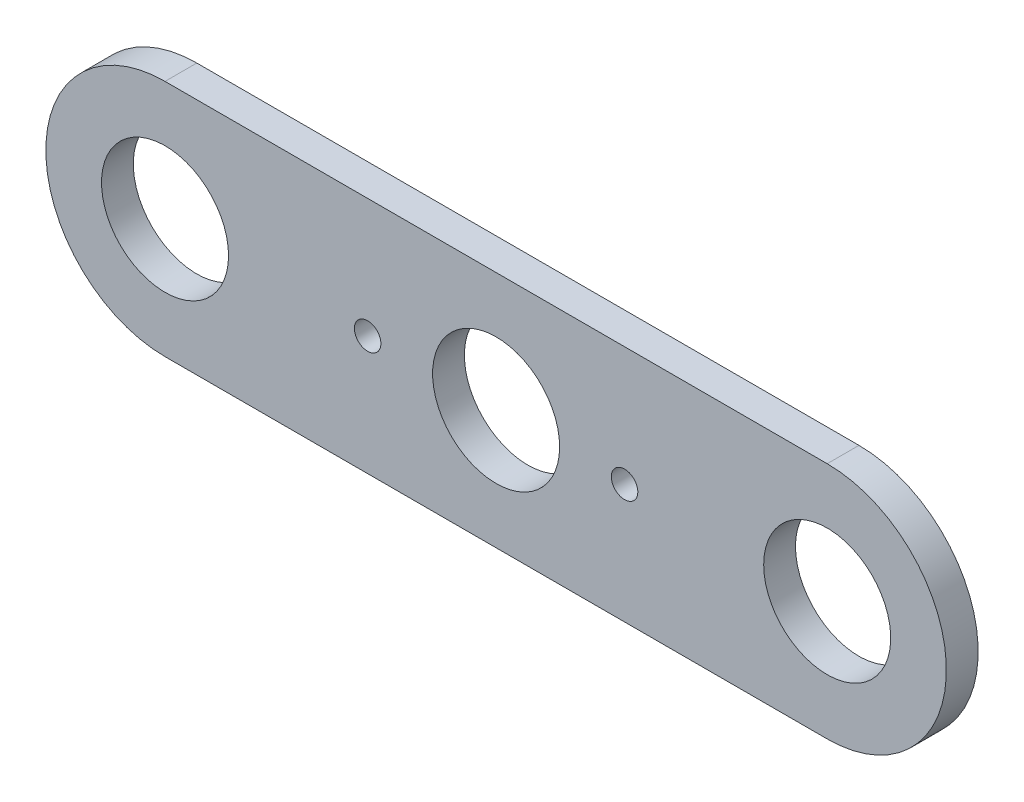
ISO-10303-21;
HEADER;
FILE_DESCRIPTION(('STEP AP214'),'2;1');
FILE_NAME('part.step','',(''),(''),'','','');
FILE_SCHEMA(('AUTOMOTIVE_DESIGN { 1 0 10303 214 1 1 1 1 }'));
ENDSEC;
DATA;
#1=APPLICATION_CONTEXT('core data for automotive mechanical design processes');
#2=APPLICATION_PROTOCOL_DEFINITION('international standard','automotive_design',2000,#1);
#3=PRODUCT_CONTEXT('',#1,'mechanical');
#4=PRODUCT('Part','Part','',(#3));
#5=PRODUCT_RELATED_PRODUCT_CATEGORY('part','',(#4));
#6=PRODUCT_DEFINITION_FORMATION('','',#4);
#7=PRODUCT_DEFINITION_CONTEXT('part definition',#1,'design');
#8=PRODUCT_DEFINITION('design','',#6,#7);
#9=PRODUCT_DEFINITION_SHAPE('','',#8);
#10=(LENGTH_UNIT() NAMED_UNIT(*) SI_UNIT(.MILLI.,.METRE.));
#11=(NAMED_UNIT(*) PLANE_ANGLE_UNIT() SI_UNIT($,.RADIAN.));
#12=(NAMED_UNIT(*) SI_UNIT($,.STERADIAN.) SOLID_ANGLE_UNIT());
#13=UNCERTAINTY_MEASURE_WITH_UNIT(LENGTH_MEASURE(1.E-05),#10,'distance_accuracy_value','');
#14=(GEOMETRIC_REPRESENTATION_CONTEXT(3) GLOBAL_UNCERTAINTY_ASSIGNED_CONTEXT((#13)) GLOBAL_UNIT_ASSIGNED_CONTEXT((#10,
#11,#12)) REPRESENTATION_CONTEXT('',''));
#15=CARTESIAN_POINT('',(0.,0.,0.));
#16=DIRECTION('',(0.,0.,1.));
#17=DIRECTION('',(1.,0.,0.));
#18=AXIS2_PLACEMENT_3D('',#15,#16,#17);
#19=CARTESIAN_POINT('',(62.5,0.,6.));
#20=DIRECTION('',(0.,0.,1.));
#21=DIRECTION('',(1.,0.,0.));
#22=AXIS2_PLACEMENT_3D('',#19,#20,#21);
#23=PLANE('',#22);
#24=CARTESIAN_POINT('',(-24.25,0.,6.));
#25=DIRECTION('',(0.,0.,1.));
#26=DIRECTION('',(1.,0.,0.));
#27=AXIS2_PLACEMENT_3D('',#24,#25,#26);
#28=CIRCLE('',#27,2.49999999999999);
#29=CARTESIAN_POINT('',(-21.75,0.,6.));
#30=VERTEX_POINT('',#29);
#31=EDGE_CURVE('E119',#30,#30,#28,.T.);
#32=ORIENTED_EDGE('',*,*,#31,.F.);
#33=EDGE_LOOP('',(#32));
#34=FACE_BOUND('',#33,.T.);
#35=CARTESIAN_POINT('',(24.25,0.,6.));
#36=DIRECTION('',(0.,0.,1.));
#37=DIRECTION('',(-1.,0.,0.));
#38=AXIS2_PLACEMENT_3D('',#35,#36,#37);
#39=CIRCLE('',#38,2.50000000000001);
#40=CARTESIAN_POINT('',(21.75,0.,6.));
#41=VERTEX_POINT('',#40);
#42=EDGE_CURVE('E124',#41,#41,#39,.T.);
#43=ORIENTED_EDGE('',*,*,#42,.F.);
#44=EDGE_LOOP('',(#43));
#45=FACE_BOUND('',#44,.T.);
#46=CARTESIAN_POINT('',(62.5,0.,6.));
#47=DIRECTION('',(0.,0.,1.));
#48=DIRECTION('',(-1.,0.,0.));
#49=AXIS2_PLACEMENT_3D('',#46,#47,#48);
#50=CIRCLE('',#49,11.99);
#51=CARTESIAN_POINT('',(50.51,0.,6.));
#52=VERTEX_POINT('',#51);
#53=EDGE_CURVE('E132',#52,#52,#50,.T.);
#54=ORIENTED_EDGE('',*,*,#53,.F.);
#55=EDGE_LOOP('',(#54));
#56=FACE_BOUND('',#55,.T.);
#57=CARTESIAN_POINT('',(62.5,0.,6.));
#58=DIRECTION('',(0.,0.,1.));
#59=DIRECTION('',(1.,0.,0.));
#60=AXIS2_PLACEMENT_3D('',#57,#58,#59);
#61=CIRCLE('',#60,22.5);
#62=CARTESIAN_POINT('',(62.5,-22.5,6.));
#63=VERTEX_POINT('',#62);
#64=CARTESIAN_POINT('',(62.5,22.5,6.));
#65=VERTEX_POINT('',#64);
#66=EDGE_CURVE('E91',#63,#65,#61,.T.);
#67=ORIENTED_EDGE('',*,*,#66,.T.);
#68=DIRECTION('',(-1.,0.,0.));
#69=VECTOR('',#68,1.);
#70=CARTESIAN_POINT('',(-62.5,22.5,6.));
#71=LINE('',#70,#69);
#72=CARTESIAN_POINT('',(-62.5,22.5,6.));
#73=VERTEX_POINT('',#72);
#74=EDGE_CURVE('E86',#65,#73,#71,.T.);
#75=ORIENTED_EDGE('',*,*,#74,.T.);
#76=CARTESIAN_POINT('',(-62.5,0.,6.));
#77=DIRECTION('',(0.,0.,1.));
#78=DIRECTION('',(-1.,0.,0.));
#79=AXIS2_PLACEMENT_3D('',#76,#77,#78);
#80=CIRCLE('',#79,22.5);
#81=CARTESIAN_POINT('',(-62.5,-22.5,6.));
#82=VERTEX_POINT('',#81);
#83=EDGE_CURVE('E93',#73,#82,#80,.T.);
#84=ORIENTED_EDGE('',*,*,#83,.T.);
#85=DIRECTION('',(1.,0.,0.));
#86=VECTOR('',#85,1.);
#87=CARTESIAN_POINT('',(-62.5,-22.5,6.));
#88=LINE('',#87,#86);
#89=EDGE_CURVE('E59',#82,#63,#88,.T.);
#90=ORIENTED_EDGE('',*,*,#89,.T.);
#91=EDGE_LOOP('',(#67,#75,#84,#90));
#92=FACE_BOUND('',#91,.T.);
#93=CARTESIAN_POINT('',(-62.5,0.,6.));
#94=DIRECTION('',(0.,0.,1.));
#95=DIRECTION('',(1.,0.,0.));
#96=AXIS2_PLACEMENT_3D('',#93,#94,#95);
#97=CIRCLE('',#96,11.99);
#98=CARTESIAN_POINT('',(-50.51,0.,6.));
#99=VERTEX_POINT('',#98);
#100=EDGE_CURVE('E108',#99,#99,#97,.T.);
#101=ORIENTED_EDGE('',*,*,#100,.F.);
#102=EDGE_LOOP('',(#101));
#103=FACE_BOUND('',#102,.T.);
#104=CARTESIAN_POINT('',(0.,0.,6.));
#105=DIRECTION('',(0.,0.,1.));
#106=DIRECTION('',(1.,0.,0.));
#107=AXIS2_PLACEMENT_3D('',#104,#105,#106);
#108=CIRCLE('',#107,11.99);
#109=CARTESIAN_POINT('',(11.99,0.,6.));
#110=VERTEX_POINT('',#109);
#111=EDGE_CURVE('E129',#110,#110,#108,.T.);
#112=ORIENTED_EDGE('',*,*,#111,.F.);
#113=EDGE_LOOP('',(#112));
#114=FACE_BOUND('',#113,.T.);
#115=ADVANCED_FACE('F39',(#34,#45,#56,#92,#103,#114),#23,.T.);
#116=CARTESIAN_POINT('',(62.5,0.,0.));
#117=DIRECTION('',(0.,0.,1.));
#118=DIRECTION('',(1.,0.,0.));
#119=AXIS2_PLACEMENT_3D('',#116,#117,#118);
#120=PLANE('',#119);
#121=CARTESIAN_POINT('',(-24.25,0.,0.));
#122=DIRECTION('',(0.,0.,1.));
#123=DIRECTION('',(1.,0.,0.));
#124=AXIS2_PLACEMENT_3D('',#121,#122,#123);
#125=CIRCLE('',#124,2.49999999999999);
#126=CARTESIAN_POINT('',(-21.75,0.,0.));
#127=VERTEX_POINT('',#126);
#128=EDGE_CURVE('E43',#127,#127,#125,.T.);
#129=ORIENTED_EDGE('',*,*,#128,.T.);
#130=EDGE_LOOP('',(#129));
#131=FACE_BOUND('',#130,.T.);
#132=CARTESIAN_POINT('',(24.25,0.,0.));
#133=DIRECTION('',(0.,0.,1.));
#134=DIRECTION('',(1.,0.,0.));
#135=AXIS2_PLACEMENT_3D('',#132,#133,#134);
#136=CIRCLE('',#135,2.50000000000001);
#137=CARTESIAN_POINT('',(26.75,0.,0.));
#138=VERTEX_POINT('',#137);
#139=EDGE_CURVE('E111',#138,#138,#136,.T.);
#140=ORIENTED_EDGE('',*,*,#139,.T.);
#141=EDGE_LOOP('',(#140));
#142=FACE_BOUND('',#141,.T.);
#143=CARTESIAN_POINT('',(62.5,0.,0.));
#144=DIRECTION('',(0.,0.,1.));
#145=DIRECTION('',(1.,0.,0.));
#146=AXIS2_PLACEMENT_3D('',#143,#144,#145);
#147=CIRCLE('',#146,22.5);
#148=CARTESIAN_POINT('',(62.5,-22.5,0.));
#149=VERTEX_POINT('',#148);
#150=CARTESIAN_POINT('',(62.5,22.5,0.));
#151=VERTEX_POINT('',#150);
#152=EDGE_CURVE('E106',#149,#151,#147,.T.);
#153=ORIENTED_EDGE('',*,*,#152,.F.);
#154=DIRECTION('',(1.,0.,0.));
#155=VECTOR('',#154,1.);
#156=CARTESIAN_POINT('',(-62.5,-22.5,0.));
#157=LINE('',#156,#155);
#158=CARTESIAN_POINT('',(-62.5,-22.5,0.));
#159=VERTEX_POINT('',#158);
#160=EDGE_CURVE('E82',#159,#149,#157,.T.);
#161=ORIENTED_EDGE('',*,*,#160,.F.);
#162=CARTESIAN_POINT('',(-62.5,0.,0.));
#163=DIRECTION('',(0.,0.,1.));
#164=DIRECTION('',(-1.,0.,0.));
#165=AXIS2_PLACEMENT_3D('',#162,#163,#164);
#166=CIRCLE('',#165,22.5);
#167=CARTESIAN_POINT('',(-62.5,22.5,0.));
#168=VERTEX_POINT('',#167);
#169=EDGE_CURVE('E73',#168,#159,#166,.T.);
#170=ORIENTED_EDGE('',*,*,#169,.F.);
#171=DIRECTION('',(-1.,0.,0.));
#172=VECTOR('',#171,1.);
#173=CARTESIAN_POINT('',(-62.5,22.5,0.));
#174=LINE('',#173,#172);
#175=EDGE_CURVE('E100',#151,#168,#174,.T.);
#176=ORIENTED_EDGE('',*,*,#175,.F.);
#177=EDGE_LOOP('',(#153,#161,#170,#176));
#178=FACE_BOUND('',#177,.T.);
#179=CARTESIAN_POINT('',(-62.5,0.,0.));
#180=DIRECTION('',(0.,0.,1.));
#181=DIRECTION('',(1.,0.,0.));
#182=AXIS2_PLACEMENT_3D('',#179,#180,#181);
#183=CIRCLE('',#182,11.99);
#184=CARTESIAN_POINT('',(-50.51,0.,0.));
#185=VERTEX_POINT('',#184);
#186=EDGE_CURVE('E140',#185,#185,#183,.T.);
#187=ORIENTED_EDGE('',*,*,#186,.T.);
#188=EDGE_LOOP('',(#187));
#189=FACE_BOUND('',#188,.T.);
#190=CARTESIAN_POINT('',(62.5,0.,0.));
#191=DIRECTION('',(0.,0.,1.));
#192=DIRECTION('',(-1.,0.,0.));
#193=AXIS2_PLACEMENT_3D('',#190,#191,#192);
#194=CIRCLE('',#193,11.99);
#195=CARTESIAN_POINT('',(50.51,0.,0.));
#196=VERTEX_POINT('',#195);
#197=EDGE_CURVE('E131',#196,#196,#194,.T.);
#198=ORIENTED_EDGE('',*,*,#197,.T.);
#199=EDGE_LOOP('',(#198));
#200=FACE_BOUND('',#199,.T.);
#201=CARTESIAN_POINT('',(0.,0.,0.));
#202=DIRECTION('',(0.,0.,1.));
#203=DIRECTION('',(1.,0.,0.));
#204=AXIS2_PLACEMENT_3D('',#201,#202,#203);
#205=CIRCLE('',#204,11.99);
#206=CARTESIAN_POINT('',(11.99,0.,0.));
#207=VERTEX_POINT('',#206);
#208=EDGE_CURVE('E117',#207,#207,#205,.T.);
#209=ORIENTED_EDGE('',*,*,#208,.T.);
#210=EDGE_LOOP('',(#209));
#211=FACE_BOUND('',#210,.T.);
#212=ADVANCED_FACE('F148',(#131,#142,#178,#189,#200,#211),#120,.F.);
#213=CARTESIAN_POINT('',(62.5,0.,6.));
#214=DIRECTION('',(0.,0.,-1.));
#215=DIRECTION('',(-1.,0.,0.));
#216=AXIS2_PLACEMENT_3D('',#213,#214,#215);
#217=CYLINDRICAL_SURFACE('',#216,22.5);
#218=ORIENTED_EDGE('',*,*,#152,.T.);
#219=DIRECTION('',(0.,0.,-1.));
#220=VECTOR('',#219,1.);
#221=CARTESIAN_POINT('',(62.5,22.5,6.));
#222=LINE('',#221,#220);
#223=EDGE_CURVE('E11',#65,#151,#222,.T.);
#224=ORIENTED_EDGE('',*,*,#223,.F.);
#225=ORIENTED_EDGE('',*,*,#66,.F.);
#226=DIRECTION('',(0.,0.,-1.));
#227=VECTOR('',#226,1.);
#228=CARTESIAN_POINT('',(62.5,-22.5,6.));
#229=LINE('',#228,#227);
#230=EDGE_CURVE('E105',#63,#149,#229,.T.);
#231=ORIENTED_EDGE('',*,*,#230,.T.);
#232=EDGE_LOOP('',(#218,#224,#225,#231));
#233=FACE_BOUND('',#232,.T.);
#234=ADVANCED_FACE('F41',(#233),#217,.T.);
#235=CARTESIAN_POINT('',(-62.5,22.5,6.));
#236=DIRECTION('',(0.,-1.,0.));
#237=DIRECTION('',(1.,0.,0.));
#238=AXIS2_PLACEMENT_3D('',#235,#236,#237);
#239=PLANE('',#238);
#240=ORIENTED_EDGE('',*,*,#175,.T.);
#241=DIRECTION('',(0.,0.,-1.));
#242=VECTOR('',#241,1.);
#243=CARTESIAN_POINT('',(-62.5,22.5,6.));
#244=LINE('',#243,#242);
#245=EDGE_CURVE('E47',#73,#168,#244,.T.);
#246=ORIENTED_EDGE('',*,*,#245,.F.);
#247=ORIENTED_EDGE('',*,*,#74,.F.);
#248=ORIENTED_EDGE('',*,*,#223,.T.);
#249=EDGE_LOOP('',(#240,#246,#247,#248));
#250=FACE_BOUND('',#249,.T.);
#251=ADVANCED_FACE('F96',(#250),#239,.F.);
#252=CARTESIAN_POINT('',(-62.5,0.,6.));
#253=DIRECTION('',(0.,0.,-1.));
#254=DIRECTION('',(-1.,0.,0.));
#255=AXIS2_PLACEMENT_3D('',#252,#253,#254);
#256=CYLINDRICAL_SURFACE('',#255,22.5);
#257=ORIENTED_EDGE('',*,*,#169,.T.);
#258=DIRECTION('',(0.,0.,-1.));
#259=VECTOR('',#258,1.);
#260=CARTESIAN_POINT('',(-62.5,-22.5,6.));
#261=LINE('',#260,#259);
#262=EDGE_CURVE('E98',#82,#159,#261,.T.);
#263=ORIENTED_EDGE('',*,*,#262,.F.);
#264=ORIENTED_EDGE('',*,*,#83,.F.);
#265=ORIENTED_EDGE('',*,*,#245,.T.);
#266=EDGE_LOOP('',(#257,#263,#264,#265));
#267=FACE_BOUND('',#266,.T.);
#268=ADVANCED_FACE('F99',(#267),#256,.T.);
#269=CARTESIAN_POINT('',(-62.5,-22.5,6.));
#270=DIRECTION('',(0.,1.,0.));
#271=DIRECTION('',(-1.,0.,0.));
#272=AXIS2_PLACEMENT_3D('',#269,#270,#271);
#273=PLANE('',#272);
#274=ORIENTED_EDGE('',*,*,#160,.T.);
#275=ORIENTED_EDGE('',*,*,#230,.F.);
#276=ORIENTED_EDGE('',*,*,#89,.F.);
#277=ORIENTED_EDGE('',*,*,#262,.T.);
#278=EDGE_LOOP('',(#274,#275,#276,#277));
#279=FACE_BOUND('',#278,.T.);
#280=ADVANCED_FACE('F155',(#279),#273,.F.);
#281=CARTESIAN_POINT('',(-62.5,0.,6.));
#282=DIRECTION('',(0.,0.,-1.));
#283=DIRECTION('',(-1.,0.,0.));
#284=AXIS2_PLACEMENT_3D('',#281,#282,#283);
#285=CYLINDRICAL_SURFACE('',#284,11.99);
#286=ORIENTED_EDGE('',*,*,#100,.T.);
#287=EDGE_LOOP('',(#286));
#288=FACE_BOUND('',#287,.T.);
#289=ORIENTED_EDGE('',*,*,#186,.F.);
#290=EDGE_LOOP('',(#289));
#291=FACE_BOUND('',#290,.T.);
#292=ADVANCED_FACE('F149',(#288,#291),#285,.F.);
#293=CARTESIAN_POINT('',(62.5,0.,6.));
#294=DIRECTION('',(0.,0.,-1.));
#295=DIRECTION('',(-1.,0.,0.));
#296=AXIS2_PLACEMENT_3D('',#293,#294,#295);
#297=CYLINDRICAL_SURFACE('',#296,11.99);
#298=ORIENTED_EDGE('',*,*,#53,.T.);
#299=EDGE_LOOP('',(#298));
#300=FACE_BOUND('',#299,.T.);
#301=ORIENTED_EDGE('',*,*,#197,.F.);
#302=EDGE_LOOP('',(#301));
#303=FACE_BOUND('',#302,.T.);
#304=ADVANCED_FACE('F151',(#300,#303),#297,.F.);
#305=CARTESIAN_POINT('',(0.,0.,6.));
#306=DIRECTION('',(0.,0.,-1.));
#307=DIRECTION('',(-1.,0.,0.));
#308=AXIS2_PLACEMENT_3D('',#305,#306,#307);
#309=CYLINDRICAL_SURFACE('',#308,11.99);
#310=ORIENTED_EDGE('',*,*,#111,.T.);
#311=EDGE_LOOP('',(#310));
#312=FACE_BOUND('',#311,.T.);
#313=ORIENTED_EDGE('',*,*,#208,.F.);
#314=EDGE_LOOP('',(#313));
#315=FACE_BOUND('',#314,.T.);
#316=ADVANCED_FACE('F157',(#312,#315),#309,.F.);
#317=CARTESIAN_POINT('',(24.25,0.,-4.));
#318=DIRECTION('',(0.,0.,1.));
#319=DIRECTION('',(1.,0.,0.));
#320=AXIS2_PLACEMENT_3D('',#317,#318,#319);
#321=CYLINDRICAL_SURFACE('',#320,2.50000000000001);
#322=ORIENTED_EDGE('',*,*,#42,.T.);
#323=EDGE_LOOP('',(#322));
#324=FACE_BOUND('',#323,.T.);
#325=ORIENTED_EDGE('',*,*,#139,.F.);
#326=EDGE_LOOP('',(#325));
#327=FACE_BOUND('',#326,.T.);
#328=ADVANCED_FACE('F224',(#324,#327),#321,.F.);
#329=CARTESIAN_POINT('',(-24.25,0.,-4.));
#330=DIRECTION('',(0.,0.,1.));
#331=DIRECTION('',(1.,0.,0.));
#332=AXIS2_PLACEMENT_3D('',#329,#330,#331);
#333=CYLINDRICAL_SURFACE('',#332,2.49999999999999);
#334=ORIENTED_EDGE('',*,*,#31,.T.);
#335=EDGE_LOOP('',(#334));
#336=FACE_BOUND('',#335,.T.);
#337=ORIENTED_EDGE('',*,*,#128,.F.);
#338=EDGE_LOOP('',(#337));
#339=FACE_BOUND('',#338,.T.);
#340=ADVANCED_FACE('F235',(#336,#339),#333,.F.);
#341=CLOSED_SHELL('',(#115,#212,#234,#251,#268,#280,#292,#304,#316,#328,#340));
#342=MANIFOLD_SOLID_BREP('B2',#341);
#343=ADVANCED_BREP_SHAPE_REPRESENTATION('',(#18,#342),#14);
#344=SHAPE_DEFINITION_REPRESENTATION(#9,#343);
ENDSEC;
END-ISO-10303-21;
